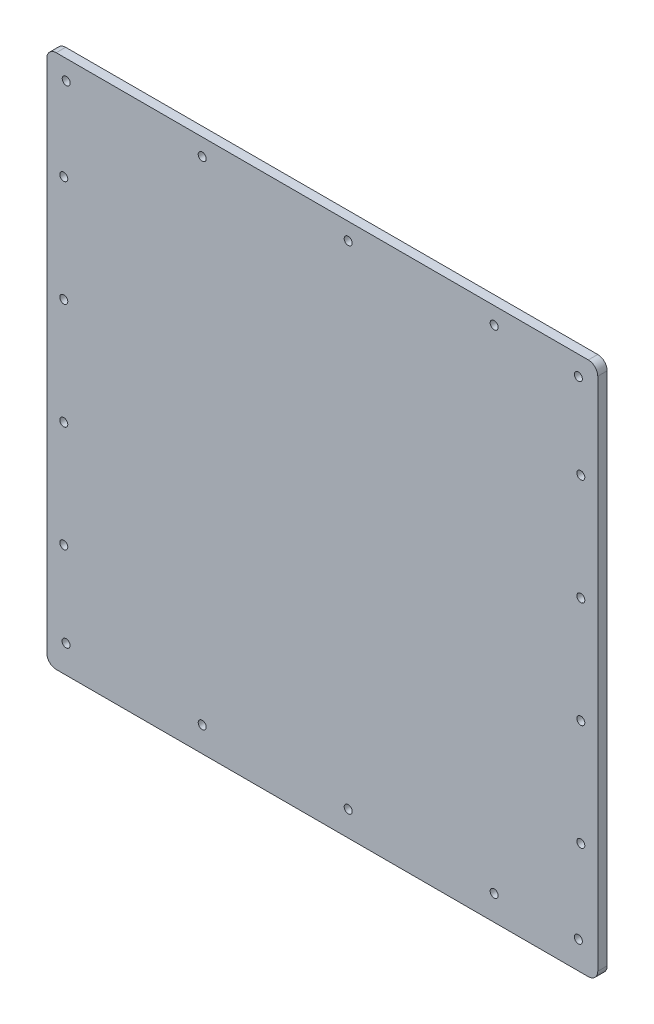
ISO-10303-21;
HEADER;
FILE_DESCRIPTION(('STEP AP214'),'2;1');
FILE_NAME('part.step','',(''),(''),'','','');
FILE_SCHEMA(('AUTOMOTIVE_DESIGN { 1 0 10303 214 1 1 1 1 }'));
ENDSEC;
DATA;
#1=APPLICATION_CONTEXT('core data for automotive mechanical design processes');
#2=APPLICATION_PROTOCOL_DEFINITION('international standard','automotive_design',2000,#1);
#3=PRODUCT_CONTEXT('',#1,'mechanical');
#4=PRODUCT('Part','Part','',(#3));
#5=PRODUCT_RELATED_PRODUCT_CATEGORY('part','',(#4));
#6=PRODUCT_DEFINITION_FORMATION('','',#4);
#7=PRODUCT_DEFINITION_CONTEXT('part definition',#1,'design');
#8=PRODUCT_DEFINITION('design','',#6,#7);
#9=PRODUCT_DEFINITION_SHAPE('','',#8);
#10=(LENGTH_UNIT() NAMED_UNIT(*) SI_UNIT(.MILLI.,.METRE.));
#11=(NAMED_UNIT(*) PLANE_ANGLE_UNIT() SI_UNIT($,.RADIAN.));
#12=(NAMED_UNIT(*) SI_UNIT($,.STERADIAN.) SOLID_ANGLE_UNIT());
#13=UNCERTAINTY_MEASURE_WITH_UNIT(LENGTH_MEASURE(1.E-05),#10,'distance_accuracy_value','');
#14=(GEOMETRIC_REPRESENTATION_CONTEXT(3) GLOBAL_UNCERTAINTY_ASSIGNED_CONTEXT((#13)) GLOBAL_UNIT_ASSIGNED_CONTEXT((#10,
#11,#12)) REPRESENTATION_CONTEXT('',''));
#15=CARTESIAN_POINT('',(0.,0.,0.));
#16=DIRECTION('',(0.,0.,1.));
#17=DIRECTION('',(1.,0.,0.));
#18=AXIS2_PLACEMENT_3D('',#15,#16,#17);
#19=CARTESIAN_POINT('',(-2.49999999999993,-422.308814801071,10.));
#20=DIRECTION('',(0.,0.,-1.));
#21=DIRECTION('',(-1.,0.,0.));
#22=AXIS2_PLACEMENT_3D('',#19,#20,#21);
#23=CYLINDRICAL_SURFACE('',#22,10.);
#24=CARTESIAN_POINT('',(-2.49999999999993,-422.308814801071,0.));
#25=DIRECTION('',(0.,0.,1.));
#26=DIRECTION('',(1.,0.,0.));
#27=AXIS2_PLACEMENT_3D('',#24,#25,#26);
#28=CIRCLE('',#27,10.);
#29=CARTESIAN_POINT('',(-12.4999999999999,-422.308814801071,0.));
#30=VERTEX_POINT('',#29);
#31=CARTESIAN_POINT('',(-2.49999999999993,-432.308814801071,0.));
#32=VERTEX_POINT('',#31);
#33=EDGE_CURVE('E137',#30,#32,#28,.T.);
#34=ORIENTED_EDGE('',*,*,#33,.T.);
#35=DIRECTION('',(0.,0.,-1.));
#36=VECTOR('',#35,1.);
#37=CARTESIAN_POINT('',(-2.49999999999993,-432.308814801071,10.));
#38=LINE('',#37,#36);
#39=CARTESIAN_POINT('',(-2.49999999999993,-432.308814801071,10.));
#40=VERTEX_POINT('',#39);
#41=EDGE_CURVE('E11',#40,#32,#38,.T.);
#42=ORIENTED_EDGE('',*,*,#41,.F.);
#43=CARTESIAN_POINT('',(-2.49999999999993,-422.308814801071,10.));
#44=DIRECTION('',(0.,0.,1.));
#45=DIRECTION('',(1.,0.,0.));
#46=AXIS2_PLACEMENT_3D('',#43,#44,#45);
#47=CIRCLE('',#46,10.);
#48=CARTESIAN_POINT('',(-12.4999999999999,-422.308814801071,10.));
#49=VERTEX_POINT('',#48);
#50=EDGE_CURVE('E152',#49,#40,#47,.T.);
#51=ORIENTED_EDGE('',*,*,#50,.F.);
#52=DIRECTION('',(0.,0.,-1.));
#53=VECTOR('',#52,1.);
#54=CARTESIAN_POINT('',(-12.4999999999999,-422.308814801071,10.));
#55=LINE('',#54,#53);
#56=EDGE_CURVE('E133',#49,#30,#55,.T.);
#57=ORIENTED_EDGE('',*,*,#56,.T.);
#58=EDGE_LOOP('',(#34,#42,#51,#57));
#59=FACE_BOUND('',#58,.T.);
#60=ADVANCED_FACE('F41',(#59),#23,.T.);
#61=CARTESIAN_POINT('',(-2.49999999999993,-432.308814801071,10.));
#62=DIRECTION('',(0.,1.,0.));
#63=DIRECTION('',(0.,0.,1.));
#64=AXIS2_PLACEMENT_3D('',#61,#62,#63);
#65=PLANE('',#64);
#66=DIRECTION('',(1.,0.,0.));
#67=VECTOR('',#66,1.);
#68=CARTESIAN_POINT('',(-2.49999999999993,-432.308814801071,0.));
#69=LINE('',#68,#67);
#70=CARTESIAN_POINT('',(562.5,-432.308814801071,0.));
#71=VERTEX_POINT('',#70);
#72=EDGE_CURVE('E140',#32,#71,#69,.T.);
#73=ORIENTED_EDGE('',*,*,#72,.T.);
#74=DIRECTION('',(0.,0.,-1.));
#75=VECTOR('',#74,1.);
#76=CARTESIAN_POINT('',(562.5,-432.308814801071,10.));
#77=LINE('',#76,#75);
#78=CARTESIAN_POINT('',(562.5,-432.308814801071,10.));
#79=VERTEX_POINT('',#78);
#80=EDGE_CURVE('E49',#79,#71,#77,.T.);
#81=ORIENTED_EDGE('',*,*,#80,.F.);
#82=DIRECTION('',(1.,0.,0.));
#83=VECTOR('',#82,1.);
#84=CARTESIAN_POINT('',(-2.49999999999993,-432.308814801071,10.));
#85=LINE('',#84,#83);
#86=EDGE_CURVE('E100',#40,#79,#85,.T.);
#87=ORIENTED_EDGE('',*,*,#86,.F.);
#88=ORIENTED_EDGE('',*,*,#41,.T.);
#89=EDGE_LOOP('',(#73,#81,#87,#88));
#90=FACE_BOUND('',#89,.T.);
#91=ADVANCED_FACE('F349',(#90),#65,.F.);
#92=CARTESIAN_POINT('',(562.5,-422.308814801071,10.));
#93=DIRECTION('',(0.,0.,-1.));
#94=DIRECTION('',(-1.,0.,0.));
#95=AXIS2_PLACEMENT_3D('',#92,#93,#94);
#96=CYLINDRICAL_SURFACE('',#95,10.);
#97=CARTESIAN_POINT('',(562.5,-422.308814801071,0.));
#98=DIRECTION('',(0.,0.,1.));
#99=DIRECTION('',(1.,0.,0.));
#100=AXIS2_PLACEMENT_3D('',#97,#98,#99);
#101=CIRCLE('',#100,10.);
#102=CARTESIAN_POINT('',(572.5,-422.308814801071,0.));
#103=VERTEX_POINT('',#102);
#104=EDGE_CURVE('E143',#71,#103,#101,.T.);
#105=ORIENTED_EDGE('',*,*,#104,.T.);
#106=DIRECTION('',(0.,0.,-1.));
#107=VECTOR('',#106,1.);
#108=CARTESIAN_POINT('',(572.5,-422.308814801071,10.));
#109=LINE('',#108,#107);
#110=CARTESIAN_POINT('',(572.5,-422.308814801071,10.));
#111=VERTEX_POINT('',#110);
#112=EDGE_CURVE('E159',#111,#103,#109,.T.);
#113=ORIENTED_EDGE('',*,*,#112,.F.);
#114=CARTESIAN_POINT('',(562.5,-422.308814801071,10.));
#115=DIRECTION('',(0.,0.,1.));
#116=DIRECTION('',(1.,0.,0.));
#117=AXIS2_PLACEMENT_3D('',#114,#115,#116);
#118=CIRCLE('',#117,10.);
#119=EDGE_CURVE('E167',#79,#111,#118,.T.);
#120=ORIENTED_EDGE('',*,*,#119,.F.);
#121=ORIENTED_EDGE('',*,*,#80,.T.);
#122=EDGE_LOOP('',(#105,#113,#120,#121));
#123=FACE_BOUND('',#122,.T.);
#124=ADVANCED_FACE('F165',(#123),#96,.T.);
#125=CARTESIAN_POINT('',(572.5,124.876051616859,10.));
#126=DIRECTION('',(-1.,0.,0.));
#127=DIRECTION('',(0.,0.,1.));
#128=AXIS2_PLACEMENT_3D('',#125,#126,#127);
#129=PLANE('',#128);
#130=DIRECTION('',(0.,1.,0.));
#131=VECTOR('',#130,1.);
#132=CARTESIAN_POINT('',(572.5,124.876051616859,0.));
#133=LINE('',#132,#131);
#134=CARTESIAN_POINT('',(572.5,124.876051616859,0.));
#135=VERTEX_POINT('',#134);
#136=EDGE_CURVE('E145',#103,#135,#133,.T.);
#137=ORIENTED_EDGE('',*,*,#136,.T.);
#138=DIRECTION('',(0.,0.,-1.));
#139=VECTOR('',#138,1.);
#140=CARTESIAN_POINT('',(572.5,124.876051616859,10.));
#141=LINE('',#140,#139);
#142=CARTESIAN_POINT('',(572.5,124.876051616859,10.));
#143=VERTEX_POINT('',#142);
#144=EDGE_CURVE('E156',#143,#135,#141,.T.);
#145=ORIENTED_EDGE('',*,*,#144,.F.);
#146=DIRECTION('',(0.,1.,0.));
#147=VECTOR('',#146,1.);
#148=CARTESIAN_POINT('',(572.5,124.876051616859,10.));
#149=LINE('',#148,#147);
#150=EDGE_CURVE('E179',#111,#143,#149,.T.);
#151=ORIENTED_EDGE('',*,*,#150,.F.);
#152=ORIENTED_EDGE('',*,*,#112,.T.);
#153=EDGE_LOOP('',(#137,#145,#151,#152));
#154=FACE_BOUND('',#153,.T.);
#155=ADVANCED_FACE('F175',(#154),#129,.F.);
#156=CARTESIAN_POINT('',(562.5,124.876051616859,10.));
#157=DIRECTION('',(0.,0.,-1.));
#158=DIRECTION('',(-1.,0.,0.));
#159=AXIS2_PLACEMENT_3D('',#156,#157,#158);
#160=CYLINDRICAL_SURFACE('',#159,10.);
#161=CARTESIAN_POINT('',(562.5,124.876051616859,0.));
#162=DIRECTION('',(0.,0.,1.));
#163=DIRECTION('',(1.,0.,0.));
#164=AXIS2_PLACEMENT_3D('',#161,#162,#163);
#165=CIRCLE('',#164,10.);
#166=CARTESIAN_POINT('',(562.5,134.876051616859,0.));
#167=VERTEX_POINT('',#166);
#168=EDGE_CURVE('E147',#135,#167,#165,.T.);
#169=ORIENTED_EDGE('',*,*,#168,.T.);
#170=DIRECTION('',(0.,0.,-1.));
#171=VECTOR('',#170,1.);
#172=CARTESIAN_POINT('',(562.5,134.876051616859,10.));
#173=LINE('',#172,#171);
#174=CARTESIAN_POINT('',(562.5,134.876051616859,10.));
#175=VERTEX_POINT('',#174);
#176=EDGE_CURVE('E128',#175,#167,#173,.T.);
#177=ORIENTED_EDGE('',*,*,#176,.F.);
#178=CARTESIAN_POINT('',(562.5,124.876051616859,10.));
#179=DIRECTION('',(0.,0.,1.));
#180=DIRECTION('',(1.,0.,0.));
#181=AXIS2_PLACEMENT_3D('',#178,#179,#180);
#182=CIRCLE('',#181,10.);
#183=EDGE_CURVE('E119',#143,#175,#182,.T.);
#184=ORIENTED_EDGE('',*,*,#183,.F.);
#185=ORIENTED_EDGE('',*,*,#144,.T.);
#186=EDGE_LOOP('',(#169,#177,#184,#185));
#187=FACE_BOUND('',#186,.T.);
#188=ADVANCED_FACE('F178',(#187),#160,.T.);
#189=CARTESIAN_POINT('',(-2.49999999999993,134.876051616859,10.));
#190=DIRECTION('',(0.,-1.,0.));
#191=DIRECTION('',(0.,0.,-1.));
#192=AXIS2_PLACEMENT_3D('',#189,#190,#191);
#193=PLANE('',#192);
#194=DIRECTION('',(-1.,0.,0.));
#195=VECTOR('',#194,1.);
#196=CARTESIAN_POINT('',(-2.49999999999993,134.876051616859,0.));
#197=LINE('',#196,#195);
#198=CARTESIAN_POINT('',(-2.49999999999992,134.876051616859,0.));
#199=VERTEX_POINT('',#198);
#200=EDGE_CURVE('E127',#167,#199,#197,.T.);
#201=ORIENTED_EDGE('',*,*,#200,.T.);
#202=DIRECTION('',(0.,0.,-1.));
#203=VECTOR('',#202,1.);
#204=CARTESIAN_POINT('',(-2.49999999999992,134.876051616859,10.));
#205=LINE('',#204,#203);
#206=CARTESIAN_POINT('',(-2.49999999999992,134.876051616859,10.));
#207=VERTEX_POINT('',#206);
#208=EDGE_CURVE('E124',#207,#199,#205,.T.);
#209=ORIENTED_EDGE('',*,*,#208,.F.);
#210=DIRECTION('',(-1.,0.,0.));
#211=VECTOR('',#210,1.);
#212=CARTESIAN_POINT('',(-2.49999999999993,134.876051616859,10.));
#213=LINE('',#212,#211);
#214=EDGE_CURVE('E113',#175,#207,#213,.T.);
#215=ORIENTED_EDGE('',*,*,#214,.F.);
#216=ORIENTED_EDGE('',*,*,#176,.T.);
#217=EDGE_LOOP('',(#201,#209,#215,#216));
#218=FACE_BOUND('',#217,.T.);
#219=ADVANCED_FACE('F125',(#218),#193,.F.);
#220=CARTESIAN_POINT('',(-2.49999999999993,124.876051616859,10.));
#221=DIRECTION('',(0.,0.,-1.));
#222=DIRECTION('',(-1.,0.,0.));
#223=AXIS2_PLACEMENT_3D('',#220,#221,#222);
#224=CYLINDRICAL_SURFACE('',#223,10.);
#225=CARTESIAN_POINT('',(-2.49999999999993,124.876051616859,0.));
#226=DIRECTION('',(0.,0.,1.));
#227=DIRECTION('',(1.,0.,0.));
#228=AXIS2_PLACEMENT_3D('',#225,#226,#227);
#229=CIRCLE('',#228,10.);
#230=CARTESIAN_POINT('',(-12.4999999999999,124.876051616859,0.));
#231=VERTEX_POINT('',#230);
#232=EDGE_CURVE('E86',#199,#231,#229,.T.);
#233=ORIENTED_EDGE('',*,*,#232,.T.);
#234=DIRECTION('',(0.,0.,-1.));
#235=VECTOR('',#234,1.);
#236=CARTESIAN_POINT('',(-12.4999999999999,124.876051616859,10.));
#237=LINE('',#236,#235);
#238=CARTESIAN_POINT('',(-12.4999999999999,124.876051616859,10.));
#239=VERTEX_POINT('',#238);
#240=EDGE_CURVE('E129',#239,#231,#237,.T.);
#241=ORIENTED_EDGE('',*,*,#240,.F.);
#242=CARTESIAN_POINT('',(-2.49999999999993,124.876051616859,10.));
#243=DIRECTION('',(0.,0.,1.));
#244=DIRECTION('',(1.,0.,0.));
#245=AXIS2_PLACEMENT_3D('',#242,#243,#244);
#246=CIRCLE('',#245,10.);
#247=EDGE_CURVE('E117',#207,#239,#246,.T.);
#248=ORIENTED_EDGE('',*,*,#247,.F.);
#249=ORIENTED_EDGE('',*,*,#208,.T.);
#250=EDGE_LOOP('',(#233,#241,#248,#249));
#251=FACE_BOUND('',#250,.T.);
#252=ADVANCED_FACE('F131',(#251),#224,.T.);
#253=CARTESIAN_POINT('',(-12.4999999999999,124.876051616859,10.));
#254=DIRECTION('',(1.,0.,0.));
#255=DIRECTION('',(0.,0.,-1.));
#256=AXIS2_PLACEMENT_3D('',#253,#254,#255);
#257=PLANE('',#256);
#258=DIRECTION('',(0.,-1.,0.));
#259=VECTOR('',#258,1.);
#260=CARTESIAN_POINT('',(-12.4999999999999,124.876051616859,0.));
#261=LINE('',#260,#259);
#262=EDGE_CURVE('E92',#231,#30,#261,.T.);
#263=ORIENTED_EDGE('',*,*,#262,.T.);
#264=ORIENTED_EDGE('',*,*,#56,.F.);
#265=DIRECTION('',(0.,-1.,0.));
#266=VECTOR('',#265,1.);
#267=CARTESIAN_POINT('',(-12.4999999999999,124.876051616859,10.));
#268=LINE('',#267,#266);
#269=EDGE_CURVE('E57',#239,#49,#268,.T.);
#270=ORIENTED_EDGE('',*,*,#269,.F.);
#271=ORIENTED_EDGE('',*,*,#240,.T.);
#272=EDGE_LOOP('',(#263,#264,#270,#271));
#273=FACE_BOUND('',#272,.T.);
#274=ADVANCED_FACE('F297',(#273),#257,.F.);
#275=CARTESIAN_POINT('',(-2.49999999999993,-422.308814801071,10.));
#276=DIRECTION('',(0.,0.,1.));
#277=DIRECTION('',(1.,0.,0.));
#278=AXIS2_PLACEMENT_3D('',#275,#276,#277);
#279=PLANE('',#278);
#280=CARTESIAN_POINT('',(8.10660171779829,114.269449899061,10.));
#281=DIRECTION('',(0.,0.,1.));
#282=DIRECTION('',(1.,0.,0.));
#283=AXIS2_PLACEMENT_3D('',#280,#281,#282);
#284=CIRCLE('',#283,4.24999999999999);
#285=CARTESIAN_POINT('',(12.3566017177983,114.269449899061,10.));
#286=VERTEX_POINT('',#285);
#287=EDGE_CURVE('E289',#286,#286,#284,.T.);
#288=ORIENTED_EDGE('',*,*,#287,.F.);
#289=EDGE_LOOP('',(#288));
#290=FACE_BOUND('',#289,.T.);
#291=CARTESIAN_POINT('',(152.5,116.876051616859,10.));
#292=DIRECTION('',(0.,0.,1.));
#293=DIRECTION('',(1.,0.,0.));
#294=AXIS2_PLACEMENT_3D('',#291,#292,#293);
#295=CIRCLE('',#294,4.24999999999998);
#296=CARTESIAN_POINT('',(156.75,116.876051616859,10.));
#297=VERTEX_POINT('',#296);
#298=EDGE_CURVE('E283',#297,#297,#295,.T.);
#299=ORIENTED_EDGE('',*,*,#298,.F.);
#300=EDGE_LOOP('',(#299));
#301=FACE_BOUND('',#300,.T.);
#302=CARTESIAN_POINT('',(307.5,116.876051616859,10.));
#303=DIRECTION('',(0.,0.,1.));
#304=DIRECTION('',(1.,0.,0.));
#305=AXIS2_PLACEMENT_3D('',#302,#303,#304);
#306=CIRCLE('',#305,4.24999999999998);
#307=CARTESIAN_POINT('',(311.75,116.876051616859,10.));
#308=VERTEX_POINT('',#307);
#309=EDGE_CURVE('E277',#308,#308,#306,.T.);
#310=ORIENTED_EDGE('',*,*,#309,.F.);
#311=EDGE_LOOP('',(#310));
#312=FACE_BOUND('',#311,.T.);
#313=CARTESIAN_POINT('',(462.5,116.876051616859,10.));
#314=DIRECTION('',(0.,0.,1.));
#315=DIRECTION('',(1.,0.,0.));
#316=AXIS2_PLACEMENT_3D('',#313,#314,#315);
#317=CIRCLE('',#316,4.24999999999998);
#318=CARTESIAN_POINT('',(466.75,116.876051616859,10.));
#319=VERTEX_POINT('',#318);
#320=EDGE_CURVE('E271',#319,#319,#317,.T.);
#321=ORIENTED_EDGE('',*,*,#320,.F.);
#322=EDGE_LOOP('',(#321));
#323=FACE_BOUND('',#322,.T.);
#324=CARTESIAN_POINT('',(551.893398282202,114.269449899061,10.));
#325=DIRECTION('',(0.,0.,1.));
#326=DIRECTION('',(1.,0.,0.));
#327=AXIS2_PLACEMENT_3D('',#324,#325,#326);
#328=CIRCLE('',#327,4.24999999999998);
#329=CARTESIAN_POINT('',(556.143398282202,114.269449899061,10.));
#330=VERTEX_POINT('',#329);
#331=EDGE_CURVE('E265',#330,#330,#328,.T.);
#332=ORIENTED_EDGE('',*,*,#331,.F.);
#333=EDGE_LOOP('',(#332));
#334=FACE_BOUND('',#333,.T.);
#335=CARTESIAN_POINT('',(554.5,24.8760516168587,10.));
#336=DIRECTION('',(0.,0.,1.));
#337=DIRECTION('',(1.,0.,0.));
#338=AXIS2_PLACEMENT_3D('',#335,#336,#337);
#339=CIRCLE('',#338,4.24999999999998);
#340=CARTESIAN_POINT('',(558.75,24.8760516168587,10.));
#341=VERTEX_POINT('',#340);
#342=EDGE_CURVE('E259',#341,#341,#339,.T.);
#343=ORIENTED_EDGE('',*,*,#342,.F.);
#344=EDGE_LOOP('',(#343));
#345=FACE_BOUND('',#344,.T.);
#346=CARTESIAN_POINT('',(554.5,-87.9889038557846,10.));
#347=DIRECTION('',(0.,0.,1.));
#348=DIRECTION('',(1.,0.,0.));
#349=AXIS2_PLACEMENT_3D('',#346,#347,#348);
#350=CIRCLE('',#349,4.24999999999998);
#351=CARTESIAN_POINT('',(558.75,-87.9889038557846,10.));
#352=VERTEX_POINT('',#351);
#353=EDGE_CURVE('E253',#352,#352,#350,.T.);
#354=ORIENTED_EDGE('',*,*,#353,.F.);
#355=EDGE_LOOP('',(#354));
#356=FACE_BOUND('',#355,.T.);
#357=CARTESIAN_POINT('',(554.5,-200.853859328428,10.));
#358=DIRECTION('',(0.,0.,1.));
#359=DIRECTION('',(1.,0.,0.));
#360=AXIS2_PLACEMENT_3D('',#357,#358,#359);
#361=CIRCLE('',#360,4.24999999999998);
#362=CARTESIAN_POINT('',(558.75,-200.853859328428,10.));
#363=VERTEX_POINT('',#362);
#364=EDGE_CURVE('E247',#363,#363,#361,.T.);
#365=ORIENTED_EDGE('',*,*,#364,.F.);
#366=EDGE_LOOP('',(#365));
#367=FACE_BOUND('',#366,.T.);
#368=CARTESIAN_POINT('',(554.5,-313.718814801071,10.));
#369=DIRECTION('',(0.,0.,1.));
#370=DIRECTION('',(1.,0.,0.));
#371=AXIS2_PLACEMENT_3D('',#368,#369,#370);
#372=CIRCLE('',#371,4.24999999999998);
#373=CARTESIAN_POINT('',(558.75,-313.718814801071,10.));
#374=VERTEX_POINT('',#373);
#375=EDGE_CURVE('E241',#374,#374,#372,.T.);
#376=ORIENTED_EDGE('',*,*,#375,.F.);
#377=EDGE_LOOP('',(#376));
#378=FACE_BOUND('',#377,.T.);
#379=CARTESIAN_POINT('',(551.893398282202,-403.112213083273,10.));
#380=DIRECTION('',(0.,0.,1.));
#381=DIRECTION('',(1.,0.,0.));
#382=AXIS2_PLACEMENT_3D('',#379,#380,#381);
#383=CIRCLE('',#382,4.24999999999998);
#384=CARTESIAN_POINT('',(556.143398282202,-403.112213083273,10.));
#385=VERTEX_POINT('',#384);
#386=EDGE_CURVE('E235',#385,#385,#383,.T.);
#387=ORIENTED_EDGE('',*,*,#386,.F.);
#388=EDGE_LOOP('',(#387));
#389=FACE_BOUND('',#388,.T.);
#390=CARTESIAN_POINT('',(462.5,-405.718814801071,10.));
#391=DIRECTION('',(0.,0.,1.));
#392=DIRECTION('',(1.,0.,0.));
#393=AXIS2_PLACEMENT_3D('',#390,#391,#392);
#394=CIRCLE('',#393,4.24999999999998);
#395=CARTESIAN_POINT('',(466.75,-405.718814801071,10.));
#396=VERTEX_POINT('',#395);
#397=EDGE_CURVE('E229',#396,#396,#394,.T.);
#398=ORIENTED_EDGE('',*,*,#397,.F.);
#399=EDGE_LOOP('',(#398));
#400=FACE_BOUND('',#399,.T.);
#401=CARTESIAN_POINT('',(307.5,-405.718814801071,10.));
#402=DIRECTION('',(0.,0.,1.));
#403=DIRECTION('',(1.,0.,0.));
#404=AXIS2_PLACEMENT_3D('',#401,#402,#403);
#405=CIRCLE('',#404,4.24999999999998);
#406=CARTESIAN_POINT('',(311.75,-405.718814801071,10.));
#407=VERTEX_POINT('',#406);
#408=EDGE_CURVE('E223',#407,#407,#405,.T.);
#409=ORIENTED_EDGE('',*,*,#408,.F.);
#410=EDGE_LOOP('',(#409));
#411=FACE_BOUND('',#410,.T.);
#412=CARTESIAN_POINT('',(7.94313730652735,-402.946189681616,10.));
#413=DIRECTION('',(0.,0.,1.));
#414=DIRECTION('',(1.,0.,0.));
#415=AXIS2_PLACEMENT_3D('',#412,#413,#414);
#416=CIRCLE('',#415,4.24999999999999);
#417=CARTESIAN_POINT('',(12.1931373065273,-402.946189681616,10.));
#418=VERTEX_POINT('',#417);
#419=EDGE_CURVE('E217',#418,#418,#416,.T.);
#420=ORIENTED_EDGE('',*,*,#419,.F.);
#421=EDGE_LOOP('',(#420));
#422=FACE_BOUND('',#421,.T.);
#423=CARTESIAN_POINT('',(152.5,-405.718814801071,10.));
#424=DIRECTION('',(0.,0.,1.));
#425=DIRECTION('',(1.,0.,0.));
#426=AXIS2_PLACEMENT_3D('',#423,#424,#425);
#427=CIRCLE('',#426,4.24999999999998);
#428=CARTESIAN_POINT('',(156.75,-405.718814801071,10.));
#429=VERTEX_POINT('',#428);
#430=EDGE_CURVE('E211',#429,#429,#427,.T.);
#431=ORIENTED_EDGE('',*,*,#430,.F.);
#432=EDGE_LOOP('',(#431));
#433=FACE_BOUND('',#432,.T.);
#434=CARTESIAN_POINT('',(5.50000000000017,-313.718814801071,10.));
#435=DIRECTION('',(0.,0.,1.));
#436=DIRECTION('',(1.,0.,0.));
#437=AXIS2_PLACEMENT_3D('',#434,#435,#436);
#438=CIRCLE('',#437,4.24999999999999);
#439=CARTESIAN_POINT('',(9.75000000000016,-313.718814801071,10.));
#440=VERTEX_POINT('',#439);
#441=EDGE_CURVE('E205',#440,#440,#438,.T.);
#442=ORIENTED_EDGE('',*,*,#441,.F.);
#443=EDGE_LOOP('',(#442));
#444=FACE_BOUND('',#443,.T.);
#445=CARTESIAN_POINT('',(5.50000000000017,-200.853859328428,10.));
#446=DIRECTION('',(0.,0.,1.));
#447=DIRECTION('',(1.,0.,0.));
#448=AXIS2_PLACEMENT_3D('',#445,#446,#447);
#449=CIRCLE('',#448,4.24999999999999);
#450=CARTESIAN_POINT('',(9.75000000000016,-200.853859328428,10.));
#451=VERTEX_POINT('',#450);
#452=EDGE_CURVE('E199',#451,#451,#449,.T.);
#453=ORIENTED_EDGE('',*,*,#452,.F.);
#454=EDGE_LOOP('',(#453));
#455=FACE_BOUND('',#454,.T.);
#456=CARTESIAN_POINT('',(5.50000000000017,-87.9889038557846,10.));
#457=DIRECTION('',(0.,0.,1.));
#458=DIRECTION('',(1.,0.,0.));
#459=AXIS2_PLACEMENT_3D('',#456,#457,#458);
#460=CIRCLE('',#459,4.24999999999999);
#461=CARTESIAN_POINT('',(9.75000000000016,-87.9889038557846,10.));
#462=VERTEX_POINT('',#461);
#463=EDGE_CURVE('E193',#462,#462,#460,.T.);
#464=ORIENTED_EDGE('',*,*,#463,.F.);
#465=EDGE_LOOP('',(#464));
#466=FACE_BOUND('',#465,.T.);
#467=CARTESIAN_POINT('',(5.50000000000017,24.8760516168587,10.));
#468=DIRECTION('',(0.,0.,1.));
#469=DIRECTION('',(1.,0.,0.));
#470=AXIS2_PLACEMENT_3D('',#467,#468,#469);
#471=CIRCLE('',#470,4.24999999999999);
#472=CARTESIAN_POINT('',(9.75000000000016,24.8760516168587,10.));
#473=VERTEX_POINT('',#472);
#474=EDGE_CURVE('E187',#473,#473,#471,.T.);
#475=ORIENTED_EDGE('',*,*,#474,.F.);
#476=EDGE_LOOP('',(#475));
#477=FACE_BOUND('',#476,.T.);
#478=ORIENTED_EDGE('',*,*,#50,.T.);
#479=ORIENTED_EDGE('',*,*,#86,.T.);
#480=ORIENTED_EDGE('',*,*,#119,.T.);
#481=ORIENTED_EDGE('',*,*,#150,.T.);
#482=ORIENTED_EDGE('',*,*,#183,.T.);
#483=ORIENTED_EDGE('',*,*,#214,.T.);
#484=ORIENTED_EDGE('',*,*,#247,.T.);
#485=ORIENTED_EDGE('',*,*,#269,.T.);
#486=EDGE_LOOP('',(#478,#479,#480,#481,#482,#483,#484,#485));
#487=FACE_BOUND('',#486,.T.);
#488=ADVANCED_FACE('F115',(#290,#301,#312,#323,#334,#345,#356,#367,#378,#389,#400,#411,#422,
#433,#444,#455,#466,#477,#487),#279,.T.);
#489=CARTESIAN_POINT('',(-2.49999999999993,-422.308814801071,0.));
#490=DIRECTION('',(0.,0.,1.));
#491=DIRECTION('',(1.,0.,0.));
#492=AXIS2_PLACEMENT_3D('',#489,#490,#491);
#493=PLANE('',#492);
#494=CARTESIAN_POINT('',(8.10660171779829,114.269449899061,0.));
#495=DIRECTION('',(0.,0.,1.));
#496=DIRECTION('',(1.,0.,0.));
#497=AXIS2_PLACEMENT_3D('',#494,#495,#496);
#498=CIRCLE('',#497,4.24999999999999);
#499=CARTESIAN_POINT('',(12.3566017177983,114.269449899061,0.));
#500=VERTEX_POINT('',#499);
#501=EDGE_CURVE('E286',#500,#500,#498,.T.);
#502=ORIENTED_EDGE('',*,*,#501,.T.);
#503=EDGE_LOOP('',(#502));
#504=FACE_BOUND('',#503,.T.);
#505=CARTESIAN_POINT('',(152.5,116.876051616859,0.));
#506=DIRECTION('',(0.,0.,1.));
#507=DIRECTION('',(1.,0.,0.));
#508=AXIS2_PLACEMENT_3D('',#505,#506,#507);
#509=CIRCLE('',#508,4.24999999999998);
#510=CARTESIAN_POINT('',(156.75,116.876051616859,0.));
#511=VERTEX_POINT('',#510);
#512=EDGE_CURVE('E280',#511,#511,#509,.T.);
#513=ORIENTED_EDGE('',*,*,#512,.T.);
#514=EDGE_LOOP('',(#513));
#515=FACE_BOUND('',#514,.T.);
#516=CARTESIAN_POINT('',(307.5,116.876051616859,0.));
#517=DIRECTION('',(0.,0.,1.));
#518=DIRECTION('',(1.,0.,0.));
#519=AXIS2_PLACEMENT_3D('',#516,#517,#518);
#520=CIRCLE('',#519,4.24999999999998);
#521=CARTESIAN_POINT('',(311.75,116.876051616859,0.));
#522=VERTEX_POINT('',#521);
#523=EDGE_CURVE('E274',#522,#522,#520,.T.);
#524=ORIENTED_EDGE('',*,*,#523,.T.);
#525=EDGE_LOOP('',(#524));
#526=FACE_BOUND('',#525,.T.);
#527=CARTESIAN_POINT('',(462.5,116.876051616859,0.));
#528=DIRECTION('',(0.,0.,1.));
#529=DIRECTION('',(1.,0.,0.));
#530=AXIS2_PLACEMENT_3D('',#527,#528,#529);
#531=CIRCLE('',#530,4.24999999999998);
#532=CARTESIAN_POINT('',(466.75,116.876051616859,0.));
#533=VERTEX_POINT('',#532);
#534=EDGE_CURVE('E268',#533,#533,#531,.T.);
#535=ORIENTED_EDGE('',*,*,#534,.T.);
#536=EDGE_LOOP('',(#535));
#537=FACE_BOUND('',#536,.T.);
#538=CARTESIAN_POINT('',(551.893398282202,114.269449899061,0.));
#539=DIRECTION('',(0.,0.,1.));
#540=DIRECTION('',(1.,0.,0.));
#541=AXIS2_PLACEMENT_3D('',#538,#539,#540);
#542=CIRCLE('',#541,4.24999999999998);
#543=CARTESIAN_POINT('',(556.143398282202,114.269449899061,0.));
#544=VERTEX_POINT('',#543);
#545=EDGE_CURVE('E262',#544,#544,#542,.T.);
#546=ORIENTED_EDGE('',*,*,#545,.T.);
#547=EDGE_LOOP('',(#546));
#548=FACE_BOUND('',#547,.T.);
#549=CARTESIAN_POINT('',(554.5,24.8760516168587,0.));
#550=DIRECTION('',(0.,0.,1.));
#551=DIRECTION('',(1.,0.,0.));
#552=AXIS2_PLACEMENT_3D('',#549,#550,#551);
#553=CIRCLE('',#552,4.24999999999998);
#554=CARTESIAN_POINT('',(558.75,24.8760516168587,0.));
#555=VERTEX_POINT('',#554);
#556=EDGE_CURVE('E256',#555,#555,#553,.T.);
#557=ORIENTED_EDGE('',*,*,#556,.T.);
#558=EDGE_LOOP('',(#557));
#559=FACE_BOUND('',#558,.T.);
#560=CARTESIAN_POINT('',(554.5,-87.9889038557846,0.));
#561=DIRECTION('',(0.,0.,1.));
#562=DIRECTION('',(1.,0.,0.));
#563=AXIS2_PLACEMENT_3D('',#560,#561,#562);
#564=CIRCLE('',#563,4.24999999999998);
#565=CARTESIAN_POINT('',(558.75,-87.9889038557846,0.));
#566=VERTEX_POINT('',#565);
#567=EDGE_CURVE('E250',#566,#566,#564,.T.);
#568=ORIENTED_EDGE('',*,*,#567,.T.);
#569=EDGE_LOOP('',(#568));
#570=FACE_BOUND('',#569,.T.);
#571=CARTESIAN_POINT('',(554.5,-200.853859328428,0.));
#572=DIRECTION('',(0.,0.,1.));
#573=DIRECTION('',(1.,0.,0.));
#574=AXIS2_PLACEMENT_3D('',#571,#572,#573);
#575=CIRCLE('',#574,4.24999999999998);
#576=CARTESIAN_POINT('',(558.75,-200.853859328428,0.));
#577=VERTEX_POINT('',#576);
#578=EDGE_CURVE('E244',#577,#577,#575,.T.);
#579=ORIENTED_EDGE('',*,*,#578,.T.);
#580=EDGE_LOOP('',(#579));
#581=FACE_BOUND('',#580,.T.);
#582=CARTESIAN_POINT('',(554.5,-313.718814801071,0.));
#583=DIRECTION('',(0.,0.,1.));
#584=DIRECTION('',(1.,0.,0.));
#585=AXIS2_PLACEMENT_3D('',#582,#583,#584);
#586=CIRCLE('',#585,4.24999999999998);
#587=CARTESIAN_POINT('',(558.75,-313.718814801071,0.));
#588=VERTEX_POINT('',#587);
#589=EDGE_CURVE('E238',#588,#588,#586,.T.);
#590=ORIENTED_EDGE('',*,*,#589,.T.);
#591=EDGE_LOOP('',(#590));
#592=FACE_BOUND('',#591,.T.);
#593=CARTESIAN_POINT('',(551.893398282202,-403.112213083273,0.));
#594=DIRECTION('',(0.,0.,1.));
#595=DIRECTION('',(1.,0.,0.));
#596=AXIS2_PLACEMENT_3D('',#593,#594,#595);
#597=CIRCLE('',#596,4.24999999999998);
#598=CARTESIAN_POINT('',(556.143398282202,-403.112213083273,0.));
#599=VERTEX_POINT('',#598);
#600=EDGE_CURVE('E232',#599,#599,#597,.T.);
#601=ORIENTED_EDGE('',*,*,#600,.T.);
#602=EDGE_LOOP('',(#601));
#603=FACE_BOUND('',#602,.T.);
#604=CARTESIAN_POINT('',(462.5,-405.718814801071,0.));
#605=DIRECTION('',(0.,0.,1.));
#606=DIRECTION('',(1.,0.,0.));
#607=AXIS2_PLACEMENT_3D('',#604,#605,#606);
#608=CIRCLE('',#607,4.24999999999998);
#609=CARTESIAN_POINT('',(466.75,-405.718814801071,0.));
#610=VERTEX_POINT('',#609);
#611=EDGE_CURVE('E226',#610,#610,#608,.T.);
#612=ORIENTED_EDGE('',*,*,#611,.T.);
#613=EDGE_LOOP('',(#612));
#614=FACE_BOUND('',#613,.T.);
#615=CARTESIAN_POINT('',(307.5,-405.718814801071,0.));
#616=DIRECTION('',(0.,0.,1.));
#617=DIRECTION('',(1.,0.,0.));
#618=AXIS2_PLACEMENT_3D('',#615,#616,#617);
#619=CIRCLE('',#618,4.24999999999998);
#620=CARTESIAN_POINT('',(311.75,-405.718814801071,0.));
#621=VERTEX_POINT('',#620);
#622=EDGE_CURVE('E220',#621,#621,#619,.T.);
#623=ORIENTED_EDGE('',*,*,#622,.T.);
#624=EDGE_LOOP('',(#623));
#625=FACE_BOUND('',#624,.T.);
#626=CARTESIAN_POINT('',(7.94313730652735,-402.946189681616,0.));
#627=DIRECTION('',(0.,0.,1.));
#628=DIRECTION('',(1.,0.,0.));
#629=AXIS2_PLACEMENT_3D('',#626,#627,#628);
#630=CIRCLE('',#629,4.24999999999999);
#631=CARTESIAN_POINT('',(12.1931373065273,-402.946189681616,0.));
#632=VERTEX_POINT('',#631);
#633=EDGE_CURVE('E214',#632,#632,#630,.T.);
#634=ORIENTED_EDGE('',*,*,#633,.T.);
#635=EDGE_LOOP('',(#634));
#636=FACE_BOUND('',#635,.T.);
#637=CARTESIAN_POINT('',(152.5,-405.718814801071,0.));
#638=DIRECTION('',(0.,0.,1.));
#639=DIRECTION('',(1.,0.,0.));
#640=AXIS2_PLACEMENT_3D('',#637,#638,#639);
#641=CIRCLE('',#640,4.24999999999998);
#642=CARTESIAN_POINT('',(156.75,-405.718814801071,0.));
#643=VERTEX_POINT('',#642);
#644=EDGE_CURVE('E208',#643,#643,#641,.T.);
#645=ORIENTED_EDGE('',*,*,#644,.T.);
#646=EDGE_LOOP('',(#645));
#647=FACE_BOUND('',#646,.T.);
#648=CARTESIAN_POINT('',(5.50000000000017,-313.718814801071,0.));
#649=DIRECTION('',(0.,0.,1.));
#650=DIRECTION('',(1.,0.,0.));
#651=AXIS2_PLACEMENT_3D('',#648,#649,#650);
#652=CIRCLE('',#651,4.24999999999999);
#653=CARTESIAN_POINT('',(9.75000000000015,-313.718814801071,0.));
#654=VERTEX_POINT('',#653);
#655=EDGE_CURVE('E202',#654,#654,#652,.T.);
#656=ORIENTED_EDGE('',*,*,#655,.T.);
#657=EDGE_LOOP('',(#656));
#658=FACE_BOUND('',#657,.T.);
#659=CARTESIAN_POINT('',(5.50000000000017,-200.853859328428,0.));
#660=DIRECTION('',(0.,0.,1.));
#661=DIRECTION('',(1.,0.,0.));
#662=AXIS2_PLACEMENT_3D('',#659,#660,#661);
#663=CIRCLE('',#662,4.24999999999999);
#664=CARTESIAN_POINT('',(9.75000000000015,-200.853859328428,0.));
#665=VERTEX_POINT('',#664);
#666=EDGE_CURVE('E196',#665,#665,#663,.T.);
#667=ORIENTED_EDGE('',*,*,#666,.T.);
#668=EDGE_LOOP('',(#667));
#669=FACE_BOUND('',#668,.T.);
#670=CARTESIAN_POINT('',(5.50000000000017,-87.9889038557846,0.));
#671=DIRECTION('',(0.,0.,1.));
#672=DIRECTION('',(1.,0.,0.));
#673=AXIS2_PLACEMENT_3D('',#670,#671,#672);
#674=CIRCLE('',#673,4.24999999999999);
#675=CARTESIAN_POINT('',(9.75000000000015,-87.9889038557846,0.));
#676=VERTEX_POINT('',#675);
#677=EDGE_CURVE('E190',#676,#676,#674,.T.);
#678=ORIENTED_EDGE('',*,*,#677,.T.);
#679=EDGE_LOOP('',(#678));
#680=FACE_BOUND('',#679,.T.);
#681=CARTESIAN_POINT('',(5.50000000000017,24.8760516168587,0.));
#682=DIRECTION('',(0.,0.,1.));
#683=DIRECTION('',(1.,0.,0.));
#684=AXIS2_PLACEMENT_3D('',#681,#682,#683);
#685=CIRCLE('',#684,4.24999999999999);
#686=CARTESIAN_POINT('',(9.75000000000015,24.8760516168587,0.));
#687=VERTEX_POINT('',#686);
#688=EDGE_CURVE('E141',#687,#687,#685,.T.);
#689=ORIENTED_EDGE('',*,*,#688,.T.);
#690=EDGE_LOOP('',(#689));
#691=FACE_BOUND('',#690,.T.);
#692=ORIENTED_EDGE('',*,*,#33,.F.);
#693=ORIENTED_EDGE('',*,*,#262,.F.);
#694=ORIENTED_EDGE('',*,*,#232,.F.);
#695=ORIENTED_EDGE('',*,*,#200,.F.);
#696=ORIENTED_EDGE('',*,*,#168,.F.);
#697=ORIENTED_EDGE('',*,*,#136,.F.);
#698=ORIENTED_EDGE('',*,*,#104,.F.);
#699=ORIENTED_EDGE('',*,*,#72,.F.);
#700=EDGE_LOOP('',(#692,#693,#694,#695,#696,#697,#698,#699));
#701=FACE_BOUND('',#700,.T.);
#702=ADVANCED_FACE('F171',(#504,#515,#526,#537,#548,#559,#570,#581,#592,#603,#614,#625,#636,
#647,#658,#669,#680,#691,#701),#493,.F.);
#703=CARTESIAN_POINT('',(5.50000000000017,24.8760516168587,10.));
#704=DIRECTION('',(0.,0.,1.));
#705=DIRECTION('',(1.,0.,0.));
#706=AXIS2_PLACEMENT_3D('',#703,#704,#705);
#707=CYLINDRICAL_SURFACE('',#706,4.24999999999999);
#708=ORIENTED_EDGE('',*,*,#688,.F.);
#709=EDGE_LOOP('',(#708));
#710=FACE_BOUND('',#709,.T.);
#711=ORIENTED_EDGE('',*,*,#474,.T.);
#712=EDGE_LOOP('',(#711));
#713=FACE_BOUND('',#712,.T.);
#714=ADVANCED_FACE('F333',(#710,#713),#707,.F.);
#715=CARTESIAN_POINT('',(5.50000000000017,-87.9889038557846,10.));
#716=DIRECTION('',(0.,0.,1.));
#717=DIRECTION('',(1.,0.,0.));
#718=AXIS2_PLACEMENT_3D('',#715,#716,#717);
#719=CYLINDRICAL_SURFACE('',#718,4.24999999999999);
#720=ORIENTED_EDGE('',*,*,#677,.F.);
#721=EDGE_LOOP('',(#720));
#722=FACE_BOUND('',#721,.T.);
#723=ORIENTED_EDGE('',*,*,#463,.T.);
#724=EDGE_LOOP('',(#723));
#725=FACE_BOUND('',#724,.T.);
#726=ADVANCED_FACE('F335',(#722,#725),#719,.F.);
#727=CARTESIAN_POINT('',(5.50000000000017,-200.853859328428,10.));
#728=DIRECTION('',(0.,0.,1.));
#729=DIRECTION('',(1.,0.,0.));
#730=AXIS2_PLACEMENT_3D('',#727,#728,#729);
#731=CYLINDRICAL_SURFACE('',#730,4.24999999999999);
#732=ORIENTED_EDGE('',*,*,#666,.F.);
#733=EDGE_LOOP('',(#732));
#734=FACE_BOUND('',#733,.T.);
#735=ORIENTED_EDGE('',*,*,#452,.T.);
#736=EDGE_LOOP('',(#735));
#737=FACE_BOUND('',#736,.T.);
#738=ADVANCED_FACE('F342',(#734,#737),#731,.F.);
#739=CARTESIAN_POINT('',(5.50000000000017,-313.718814801071,10.));
#740=DIRECTION('',(0.,0.,1.));
#741=DIRECTION('',(1.,0.,0.));
#742=AXIS2_PLACEMENT_3D('',#739,#740,#741);
#743=CYLINDRICAL_SURFACE('',#742,4.24999999999999);
#744=ORIENTED_EDGE('',*,*,#655,.F.);
#745=EDGE_LOOP('',(#744));
#746=FACE_BOUND('',#745,.T.);
#747=ORIENTED_EDGE('',*,*,#441,.T.);
#748=EDGE_LOOP('',(#747));
#749=FACE_BOUND('',#748,.T.);
#750=ADVANCED_FACE('F442',(#746,#749),#743,.F.);
#751=CARTESIAN_POINT('',(152.5,-405.718814801071,10.));
#752=DIRECTION('',(0.,0.,1.));
#753=DIRECTION('',(1.,0.,0.));
#754=AXIS2_PLACEMENT_3D('',#751,#752,#753);
#755=CYLINDRICAL_SURFACE('',#754,4.24999999999998);
#756=ORIENTED_EDGE('',*,*,#644,.F.);
#757=EDGE_LOOP('',(#756));
#758=FACE_BOUND('',#757,.T.);
#759=ORIENTED_EDGE('',*,*,#430,.T.);
#760=EDGE_LOOP('',(#759));
#761=FACE_BOUND('',#760,.T.);
#762=ADVANCED_FACE('F455',(#758,#761),#755,.F.);
#763=CARTESIAN_POINT('',(7.94313730652735,-402.946189681616,10.));
#764=DIRECTION('',(0.,0.,1.));
#765=DIRECTION('',(1.,0.,0.));
#766=AXIS2_PLACEMENT_3D('',#763,#764,#765);
#767=CYLINDRICAL_SURFACE('',#766,4.24999999999999);
#768=ORIENTED_EDGE('',*,*,#633,.F.);
#769=EDGE_LOOP('',(#768));
#770=FACE_BOUND('',#769,.T.);
#771=ORIENTED_EDGE('',*,*,#419,.T.);
#772=EDGE_LOOP('',(#771));
#773=FACE_BOUND('',#772,.T.);
#774=ADVANCED_FACE('F468',(#770,#773),#767,.F.);
#775=CARTESIAN_POINT('',(307.5,-405.718814801071,10.));
#776=DIRECTION('',(0.,0.,1.));
#777=DIRECTION('',(1.,0.,0.));
#778=AXIS2_PLACEMENT_3D('',#775,#776,#777);
#779=CYLINDRICAL_SURFACE('',#778,4.24999999999998);
#780=ORIENTED_EDGE('',*,*,#622,.F.);
#781=EDGE_LOOP('',(#780));
#782=FACE_BOUND('',#781,.T.);
#783=ORIENTED_EDGE('',*,*,#408,.T.);
#784=EDGE_LOOP('',(#783));
#785=FACE_BOUND('',#784,.T.);
#786=ADVANCED_FACE('F481',(#782,#785),#779,.F.);
#787=CARTESIAN_POINT('',(462.5,-405.718814801071,10.));
#788=DIRECTION('',(0.,0.,1.));
#789=DIRECTION('',(1.,0.,0.));
#790=AXIS2_PLACEMENT_3D('',#787,#788,#789);
#791=CYLINDRICAL_SURFACE('',#790,4.24999999999998);
#792=ORIENTED_EDGE('',*,*,#611,.F.);
#793=EDGE_LOOP('',(#792));
#794=FACE_BOUND('',#793,.T.);
#795=ORIENTED_EDGE('',*,*,#397,.T.);
#796=EDGE_LOOP('',(#795));
#797=FACE_BOUND('',#796,.T.);
#798=ADVANCED_FACE('F494',(#794,#797),#791,.F.);
#799=CARTESIAN_POINT('',(551.893398282202,-403.112213083273,10.));
#800=DIRECTION('',(0.,0.,1.));
#801=DIRECTION('',(1.,0.,0.));
#802=AXIS2_PLACEMENT_3D('',#799,#800,#801);
#803=CYLINDRICAL_SURFACE('',#802,4.24999999999998);
#804=ORIENTED_EDGE('',*,*,#600,.F.);
#805=EDGE_LOOP('',(#804));
#806=FACE_BOUND('',#805,.T.);
#807=ORIENTED_EDGE('',*,*,#386,.T.);
#808=EDGE_LOOP('',(#807));
#809=FACE_BOUND('',#808,.T.);
#810=ADVANCED_FACE('F506',(#806,#809),#803,.F.);
#811=CARTESIAN_POINT('',(554.5,-313.718814801071,10.));
#812=DIRECTION('',(0.,0.,1.));
#813=DIRECTION('',(1.,0.,0.));
#814=AXIS2_PLACEMENT_3D('',#811,#812,#813);
#815=CYLINDRICAL_SURFACE('',#814,4.24999999999998);
#816=ORIENTED_EDGE('',*,*,#589,.F.);
#817=EDGE_LOOP('',(#816));
#818=FACE_BOUND('',#817,.T.);
#819=ORIENTED_EDGE('',*,*,#375,.T.);
#820=EDGE_LOOP('',(#819));
#821=FACE_BOUND('',#820,.T.);
#822=ADVANCED_FACE('F519',(#818,#821),#815,.F.);
#823=CARTESIAN_POINT('',(554.5,-200.853859328428,10.));
#824=DIRECTION('',(0.,0.,1.));
#825=DIRECTION('',(1.,0.,0.));
#826=AXIS2_PLACEMENT_3D('',#823,#824,#825);
#827=CYLINDRICAL_SURFACE('',#826,4.24999999999998);
#828=ORIENTED_EDGE('',*,*,#578,.F.);
#829=EDGE_LOOP('',(#828));
#830=FACE_BOUND('',#829,.T.);
#831=ORIENTED_EDGE('',*,*,#364,.T.);
#832=EDGE_LOOP('',(#831));
#833=FACE_BOUND('',#832,.T.);
#834=ADVANCED_FACE('F532',(#830,#833),#827,.F.);
#835=CARTESIAN_POINT('',(554.5,-87.9889038557846,10.));
#836=DIRECTION('',(0.,0.,1.));
#837=DIRECTION('',(1.,0.,0.));
#838=AXIS2_PLACEMENT_3D('',#835,#836,#837);
#839=CYLINDRICAL_SURFACE('',#838,4.24999999999998);
#840=ORIENTED_EDGE('',*,*,#567,.F.);
#841=EDGE_LOOP('',(#840));
#842=FACE_BOUND('',#841,.T.);
#843=ORIENTED_EDGE('',*,*,#353,.T.);
#844=EDGE_LOOP('',(#843));
#845=FACE_BOUND('',#844,.T.);
#846=ADVANCED_FACE('F545',(#842,#845),#839,.F.);
#847=CARTESIAN_POINT('',(554.5,24.8760516168587,10.));
#848=DIRECTION('',(0.,0.,1.));
#849=DIRECTION('',(1.,0.,0.));
#850=AXIS2_PLACEMENT_3D('',#847,#848,#849);
#851=CYLINDRICAL_SURFACE('',#850,4.24999999999998);
#852=ORIENTED_EDGE('',*,*,#556,.F.);
#853=EDGE_LOOP('',(#852));
#854=FACE_BOUND('',#853,.T.);
#855=ORIENTED_EDGE('',*,*,#342,.T.);
#856=EDGE_LOOP('',(#855));
#857=FACE_BOUND('',#856,.T.);
#858=ADVANCED_FACE('F558',(#854,#857),#851,.F.);
#859=CARTESIAN_POINT('',(551.893398282202,114.269449899061,10.));
#860=DIRECTION('',(0.,0.,1.));
#861=DIRECTION('',(1.,0.,0.));
#862=AXIS2_PLACEMENT_3D('',#859,#860,#861);
#863=CYLINDRICAL_SURFACE('',#862,4.24999999999998);
#864=ORIENTED_EDGE('',*,*,#545,.F.);
#865=EDGE_LOOP('',(#864));
#866=FACE_BOUND('',#865,.T.);
#867=ORIENTED_EDGE('',*,*,#331,.T.);
#868=EDGE_LOOP('',(#867));
#869=FACE_BOUND('',#868,.T.);
#870=ADVANCED_FACE('F571',(#866,#869),#863,.F.);
#871=CARTESIAN_POINT('',(462.5,116.876051616859,10.));
#872=DIRECTION('',(0.,0.,1.));
#873=DIRECTION('',(1.,0.,0.));
#874=AXIS2_PLACEMENT_3D('',#871,#872,#873);
#875=CYLINDRICAL_SURFACE('',#874,4.24999999999998);
#876=ORIENTED_EDGE('',*,*,#534,.F.);
#877=EDGE_LOOP('',(#876));
#878=FACE_BOUND('',#877,.T.);
#879=ORIENTED_EDGE('',*,*,#320,.T.);
#880=EDGE_LOOP('',(#879));
#881=FACE_BOUND('',#880,.T.);
#882=ADVANCED_FACE('F584',(#878,#881),#875,.F.);
#883=CARTESIAN_POINT('',(307.5,116.876051616859,10.));
#884=DIRECTION('',(0.,0.,1.));
#885=DIRECTION('',(1.,0.,0.));
#886=AXIS2_PLACEMENT_3D('',#883,#884,#885);
#887=CYLINDRICAL_SURFACE('',#886,4.24999999999998);
#888=ORIENTED_EDGE('',*,*,#523,.F.);
#889=EDGE_LOOP('',(#888));
#890=FACE_BOUND('',#889,.T.);
#891=ORIENTED_EDGE('',*,*,#309,.T.);
#892=EDGE_LOOP('',(#891));
#893=FACE_BOUND('',#892,.T.);
#894=ADVANCED_FACE('F597',(#890,#893),#887,.F.);
#895=CARTESIAN_POINT('',(152.5,116.876051616859,10.));
#896=DIRECTION('',(0.,0.,1.));
#897=DIRECTION('',(1.,0.,0.));
#898=AXIS2_PLACEMENT_3D('',#895,#896,#897);
#899=CYLINDRICAL_SURFACE('',#898,4.24999999999998);
#900=ORIENTED_EDGE('',*,*,#512,.F.);
#901=EDGE_LOOP('',(#900));
#902=FACE_BOUND('',#901,.T.);
#903=ORIENTED_EDGE('',*,*,#298,.T.);
#904=EDGE_LOOP('',(#903));
#905=FACE_BOUND('',#904,.T.);
#906=ADVANCED_FACE('F610',(#902,#905),#899,.F.);
#907=CARTESIAN_POINT('',(8.10660171779829,114.269449899061,10.));
#908=DIRECTION('',(0.,0.,1.));
#909=DIRECTION('',(1.,0.,0.));
#910=AXIS2_PLACEMENT_3D('',#907,#908,#909);
#911=CYLINDRICAL_SURFACE('',#910,4.24999999999999);
#912=ORIENTED_EDGE('',*,*,#501,.F.);
#913=EDGE_LOOP('',(#912));
#914=FACE_BOUND('',#913,.T.);
#915=ORIENTED_EDGE('',*,*,#287,.T.);
#916=EDGE_LOOP('',(#915));
#917=FACE_BOUND('',#916,.T.);
#918=ADVANCED_FACE('F293',(#914,#917),#911,.F.);
#919=CLOSED_SHELL('',(#60,#91,#124,#155,#188,#219,#252,#274,#488,#702,#714,#726,#738,#750,#762,
#774,#786,#798,#810,#822,#834,#846,#858,#870,#882,#894,#906,#918));
#920=MANIFOLD_SOLID_BREP('B2',#919);
#921=ADVANCED_BREP_SHAPE_REPRESENTATION('',(#18,#920),#14);
#922=SHAPE_DEFINITION_REPRESENTATION(#9,#921);
ENDSEC;
END-ISO-10303-21;
